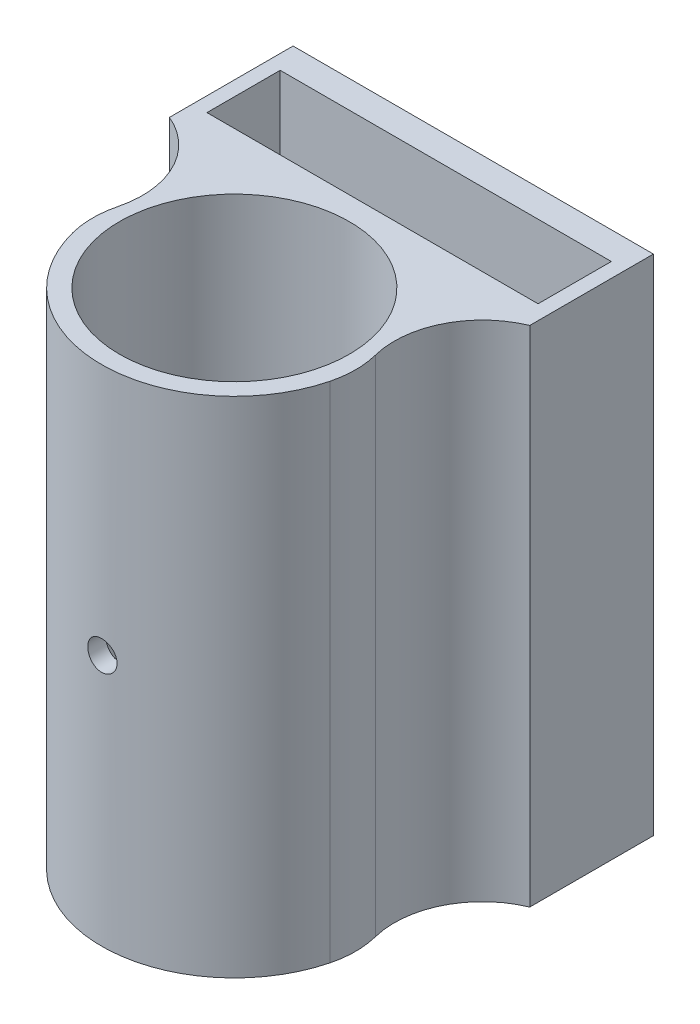
ISO-10303-21;
HEADER;
FILE_DESCRIPTION(('STEP AP214'),'2;1');
FILE_NAME('part.step','',(''),(''),'','','');
FILE_SCHEMA(('AUTOMOTIVE_DESIGN { 1 0 10303 214 1 1 1 1 }'));
ENDSEC;
DATA;
#1=APPLICATION_CONTEXT('core data for automotive mechanical design processes');
#2=APPLICATION_PROTOCOL_DEFINITION('international standard','automotive_design',2000,#1);
#3=PRODUCT_CONTEXT('',#1,'mechanical');
#4=PRODUCT('Part','Part','',(#3));
#5=PRODUCT_RELATED_PRODUCT_CATEGORY('part','',(#4));
#6=PRODUCT_DEFINITION_FORMATION('','',#4);
#7=PRODUCT_DEFINITION_CONTEXT('part definition',#1,'design');
#8=PRODUCT_DEFINITION('design','',#6,#7);
#9=PRODUCT_DEFINITION_SHAPE('','',#8);
#10=(LENGTH_UNIT() NAMED_UNIT(*) SI_UNIT(.MILLI.,.METRE.));
#11=(NAMED_UNIT(*) PLANE_ANGLE_UNIT() SI_UNIT($,.RADIAN.));
#12=(NAMED_UNIT(*) SI_UNIT($,.STERADIAN.) SOLID_ANGLE_UNIT());
#13=UNCERTAINTY_MEASURE_WITH_UNIT(LENGTH_MEASURE(1.E-05),#10,'distance_accuracy_value','');
#14=(GEOMETRIC_REPRESENTATION_CONTEXT(3) GLOBAL_UNCERTAINTY_ASSIGNED_CONTEXT((#13)) GLOBAL_UNIT_ASSIGNED_CONTEXT((#10,
#11,#12)) REPRESENTATION_CONTEXT('',''));
#15=CARTESIAN_POINT('',(0.,0.,0.));
#16=DIRECTION('',(0.,0.,1.));
#17=DIRECTION('',(1.,0.,0.));
#18=AXIS2_PLACEMENT_3D('',#15,#16,#17);
#19=CARTESIAN_POINT('',(0.,27.5,14.5));
#20=DIRECTION('',(0.,0.,-1.));
#21=DIRECTION('',(-1.,0.,0.));
#22=AXIS2_PLACEMENT_3D('',#19,#20,#21);
#23=CYLINDRICAL_SURFACE('',#22,1.6);
#24=CARTESIAN_POINT('',(0.,27.5,-15.0785283584372));
#25=DIRECTION('',(0.,0.,1.));
#26=DIRECTION('',(1.,0.,0.));
#27=AXIS2_PLACEMENT_3D('',#24,#25,#26);
#28=CIRCLE('',#27,1.6);
#29=CARTESIAN_POINT('',(1.6,27.5,-15.0785283584372));
#30=VERTEX_POINT('',#29);
#31=EDGE_CURVE('E183',#30,#30,#28,.F.);
#32=ORIENTED_EDGE('',*,*,#31,.T.);
#33=EDGE_LOOP('',(#32));
#34=FACE_BOUND('',#33,.T.);
#35=CARTESIAN_POINT('',(0.,29.1,-12.55));
#36=CARTESIAN_POINT('',(-0.0894833301704228,29.0999962076193,-12.5499987313846));
#37=CARTESIAN_POINT('',(-0.179022212237955,29.0924678743596,-12.5490328558177));
#38=CARTESIAN_POINT('',(-0.355607391045178,29.0625552971382,-12.5452726980721));
#39=CARTESIAN_POINT('',(-0.442651003326156,29.0401556370739,-12.542476518583));
#40=CARTESIAN_POINT('',(-0.611663727364265,28.9811719612015,-12.5353706866631));
#41=CARTESIAN_POINT('',(-0.69363624958007,28.9445976012485,-12.5310620647014));
#42=CARTESIAN_POINT('',(-0.850264649000386,28.858324091378,-12.5214102686347));
#43=CARTESIAN_POINT('',(-0.924921756327719,28.8086271532968,-12.5160672689167));
#44=CARTESIAN_POINT('',(-1.06524221125941,28.6972155363169,-12.5049088830017));
#45=CARTESIAN_POINT('',(-1.13085770265307,28.6354408050405,-12.499091224626));
#46=CARTESIAN_POINT('',(-1.25082012174993,28.5017561303857,-12.4876574784216));
#47=CARTESIAN_POINT('',(-1.30516646871056,28.4298456649943,-12.4820414009934));
#48=CARTESIAN_POINT('',(-1.40122693178799,28.2776187874859,-12.4716243588148));
#49=CARTESIAN_POINT('',(-1.4428960712504,28.1972737758863,-12.4668263221974));
#50=CARTESIAN_POINT('',(-1.51213203527364,28.0306549230687,-12.4586186868634));
#51=CARTESIAN_POINT('',(-1.53969941571866,27.9443813157051,-12.4552090334185));
#52=CARTESIAN_POINT('',(-1.579803594351,27.7688516136589,-12.4501859832421));
#53=CARTESIAN_POINT('',(-1.59242131099883,27.6796142883128,-12.4485629196102));
#54=CARTESIAN_POINT('',(-1.60251840715629,27.5002751149548,-12.4472672576538));
#55=CARTESIAN_POINT('',(-1.59999841912628,27.4101733032186,-12.4475945778413));
#56=CARTESIAN_POINT('',(-1.5799580361395,27.232227452455,-12.4501538541487));
#57=CARTESIAN_POINT('',(-1.56252686628452,27.1443731787067,-12.4523744808941));
#58=CARTESIAN_POINT('',(-1.51329818151392,26.9728469646147,-12.4584524882709));
#59=CARTESIAN_POINT('',(-1.48150036483147,26.8891751121625,-12.4623099032824));
#60=CARTESIAN_POINT('',(-1.40434539227785,26.7281122157532,-12.4712396682247));
#61=CARTESIAN_POINT('',(-1.35894955317275,26.6507399019988,-12.4763154759069));
#62=CARTESIAN_POINT('',(-1.2559148184711,26.5046776742575,-12.4871074529176));
#63=CARTESIAN_POINT('',(-1.19827534047084,26.4359881735416,-12.492823652702));
#64=CARTESIAN_POINT('',(-1.07189544472095,26.3087235937471,-12.5043026756613));
#65=CARTESIAN_POINT('',(-1.00307813715898,26.2502248464818,-12.5100655383666));
#66=CARTESIAN_POINT('',(-0.85656054767683,26.1455969795326,-12.5209501015383));
#67=CARTESIAN_POINT('',(-0.778860243844986,26.099467890362,-12.5260718004231));
#68=CARTESIAN_POINT('',(-0.616722753944609,26.0208883648442,-12.5351003208389));
#69=CARTESIAN_POINT('',(-0.532283176625783,25.9884428096234,-12.5390067087198));
#70=CARTESIAN_POINT('',(-0.359093469884159,25.9382124856379,-12.5451605622059));
#71=CARTESIAN_POINT('',(-0.270343550658581,25.9204270027219,-12.5474081086196));
#72=CARTESIAN_POINT('',(-0.0917123351499195,25.9001208551552,-12.5499805192907));
#73=CARTESIAN_POINT('',(-0.00184317304063769,25.8974950590728,-12.5503186250358));
#74=CARTESIAN_POINT('',(0.177053944125346,25.9073052310954,-12.5490698373495));
#75=CARTESIAN_POINT('',(0.266081917790112,25.9197408652343,-12.5474829866013));
#76=CARTESIAN_POINT('',(0.440458516079888,25.959233549322,-12.5425708329928));
#77=CARTESIAN_POINT('',(0.525818698965754,25.9862403709993,-12.5392515034267));
#78=CARTESIAN_POINT('',(0.690798531311235,26.0540565163483,-12.5312459490984));
#79=CARTESIAN_POINT('',(0.770417978620694,26.0948663257808,-12.5265596762309));
#80=CARTESIAN_POINT('',(0.922125097178057,26.1893836553831,-12.516309532134));
#81=CARTESIAN_POINT('',(0.994170160600689,26.2431590606342,-12.510741096539));
#82=CARTESIAN_POINT('',(1.12824967904296,26.3619851975019,-12.4993635419659));
#83=CARTESIAN_POINT('',(1.19028371988441,26.4270363953921,-12.4935544130424));
#84=CARTESIAN_POINT('',(1.30295415811664,26.5670311135367,-12.4823092377738));
#85=CARTESIAN_POINT('',(1.35352079241191,26.6420310029697,-12.4768756078544));
#86=CARTESIAN_POINT('',(1.44133879355319,26.7995210849199,-12.4670366735685));
#87=CARTESIAN_POINT('',(1.4785904363276,26.8820111221735,-12.4626313478929));
#88=CARTESIAN_POINT('',(1.53860851259869,27.051916382857,-12.4553643675405));
#89=CARTESIAN_POINT('',(1.56141403781726,27.1393176116935,-12.4524985501232));
#90=CARTESIAN_POINT('',(1.59201827737757,27.3167479864078,-12.4486232047332));
#91=CARTESIAN_POINT('',(1.59981772026141,27.4067770044917,-12.4476135866425));
#92=CARTESIAN_POINT('',(1.60017466687653,27.5862132057926,-12.4475676485379));
#93=CARTESIAN_POINT('',(1.59284177737647,27.6756201870882,-12.4485171382737));
#94=CARTESIAN_POINT('',(1.56337457173444,27.8519197238252,-12.4522518934506));
#95=CARTESIAN_POINT('',(1.54124025601322,27.9388122793382,-12.4550371588397));
#96=CARTESIAN_POINT('',(1.48283320344656,28.1076005037227,-12.4621251939827));
#97=CARTESIAN_POINT('',(1.44656596795327,28.1894981025926,-12.4664273732038));
#98=CARTESIAN_POINT('',(1.36093334824595,28.3460628989831,-12.4760654372791));
#99=CARTESIAN_POINT('',(1.31156777386014,28.4207299915041,-12.4814013371412));
#100=CARTESIAN_POINT('',(1.20073386741899,28.5612742589241,-12.4925519040131));
#101=CARTESIAN_POINT('',(1.13918388282476,28.6270868036932,-12.498369637983));
#102=CARTESIAN_POINT('',(1.00589901496968,28.7474909190979,-12.5098014138397));
#103=CARTESIAN_POINT('',(0.934161737398902,28.8020798444527,-12.5154154074509));
#104=CARTESIAN_POINT('',(0.782212446885113,28.8986718669238,-12.5258317602474));
#105=CARTESIAN_POINT('',(0.701968058634778,28.9406243663874,-12.5306308237861));
#106=CARTESIAN_POINT('',(0.535556047105882,29.0103981878923,-12.538843326089));
#107=CARTESIAN_POINT('',(0.44939494777081,29.0382347992469,-12.5422582632308));
#108=CARTESIAN_POINT('',(0.302327747537931,29.0723551505146,-12.5464985141084));
#109=CARTESIAN_POINT('',(0.242347391292654,29.0827069846661,-12.5478051428813));
#110=CARTESIAN_POINT('',(0.121586569637334,29.096530671138,-12.5495563134993));
#111=CARTESIAN_POINT('',(0.060806110459412,29.1000025770154,-12.5500008620552));
#112=CARTESIAN_POINT('',(0.,29.1,-12.55));
#113=B_SPLINE_CURVE_WITH_KNOTS('',3,(#35,#36,#37,#38,#39,#40,#41,#42,#43,#44,#45,#46,#47,#48,
#49,#50,#51,#52,#53,#54,#55,#56,#57,#58,#59,#60,#61,#62,#63,#64,#65,#66,#67,#68,#69,#70,#71,#72,
#73,#74,#75,#76,#77,#78,#79,#80,#81,#82,#83,#84,#85,#86,#87,#88,#89,#90,#91,#92,#93,#94,#95,#96,
#97,#98,#99,#100,#101,#102,#103,#104,#105,#106,#107,#108,#109,#110,#111,#112),.UNSPECIFIED.,.T.,
.F.,(4,2,2,2,2,2,2,2,2,2,2,2,2,2,2,2,2,2,2,2,2,2,2,2,2,2,2,2,2,2,2,2,2,2,2,2,2,2,4),(0.,
0.268227877230542,0.536734243295237,0.805058022469286,1.07333660397615,1.34298467687524,
1.61264664233013,1.88325445760796,2.15385160484095,2.42297729305399,2.69209173714863,
2.95960703679576,3.22712795577769,3.49541725668371,3.76371932239687,4.0339518850196,
4.3041851142384,4.57451465842362,4.84483103298632,5.11327050822394,5.38170403130067,
5.64921809573626,5.91674157562478,6.18569738833739,6.45466432549707,6.72522609580801,
6.99578225890502,7.26560312383989,7.53541088869875,7.80327123819353,8.07113158007406,
8.33888775915688,8.6066478259433,8.87626701588776,9.1459496793787,9.4166982504296,
9.68715293638044,9.86942175523435,10.0516891552083),.UNSPECIFIED.);
#114=CARTESIAN_POINT('',(0.,29.1,-12.55));
#115=VERTEX_POINT('',#114);
#116=EDGE_CURVE('E208',#115,#115,#113,.T.);
#117=ORIENTED_EDGE('',*,*,#116,.T.);
#118=EDGE_LOOP('',(#117));
#119=FACE_BOUND('',#118,.T.);
#120=ADVANCED_FACE('F37',(#34,#119),#23,.F.);
#121=CARTESIAN_POINT('',(-23.3751867394782,55.,-3.70334161895905));
#122=DIRECTION('',(0.,-1.,0.));
#123=DIRECTION('',(0.,0.,-1.));
#124=AXIS2_PLACEMENT_3D('',#121,#122,#123);
#125=CYLINDRICAL_SURFACE('',#124,9.616843495);
#126=CARTESIAN_POINT('',(-23.3751867394782,0.,-3.70334161895905));
#127=DIRECTION('',(0.,1.,0.));
#128=DIRECTION('',(0.,0.,1.));
#129=AXIS2_PLACEMENT_3D('',#126,#127,#128);
#130=CIRCLE('',#129,9.616843495);
#131=CARTESIAN_POINT('',(-14.0530432080162,0.,-1.34086012990048));
#132=VERTEX_POINT('',#131);
#133=CARTESIAN_POINT('',(-19.6718451205191,0.,-12.5785283584372));
#134=VERTEX_POINT('',#133);
#135=EDGE_CURVE('E281',#132,#134,#130,.T.);
#136=ORIENTED_EDGE('',*,*,#135,.F.);
#137=DIRECTION('',(0.,-1.,0.));
#138=VECTOR('',#137,1.);
#139=CARTESIAN_POINT('',(-14.0530432080162,55.,-1.34086012990048));
#140=LINE('',#139,#138);
#141=CARTESIAN_POINT('',(-14.0530432080162,55.,-1.34086012990048));
#142=VERTEX_POINT('',#141);
#143=EDGE_CURVE('E11',#132,#142,#140,.F.);
#144=ORIENTED_EDGE('',*,*,#143,.T.);
#145=CARTESIAN_POINT('',(-23.3751867394782,55.,-3.70334161895905));
#146=DIRECTION('',(0.,1.,0.));
#147=DIRECTION('',(0.,0.,1.));
#148=AXIS2_PLACEMENT_3D('',#145,#146,#147);
#149=CIRCLE('',#148,9.616843495);
#150=CARTESIAN_POINT('',(-19.6718451205191,55.,-12.5785283584372));
#151=VERTEX_POINT('',#150);
#152=EDGE_CURVE('E295',#142,#151,#149,.T.);
#153=ORIENTED_EDGE('',*,*,#152,.T.);
#154=DIRECTION('',(0.,-1.,0.));
#155=VECTOR('',#154,1.);
#156=CARTESIAN_POINT('',(-19.6718451205191,55.,-12.5785283584372));
#157=LINE('',#156,#155);
#158=EDGE_CURVE('E296',#151,#134,#157,.T.);
#159=ORIENTED_EDGE('',*,*,#158,.T.);
#160=EDGE_LOOP('',(#136,#144,#153,#159));
#161=FACE_BOUND('',#160,.T.);
#162=ADVANCED_FACE('F321',(#161),#125,.F.);
#163=CARTESIAN_POINT('',(0.,55.,0.));
#164=DIRECTION('',(0.,-1.,0.));
#165=DIRECTION('',(0.,0.,-1.));
#166=AXIS2_PLACEMENT_3D('',#163,#164,#165);
#167=CYLINDRICAL_SURFACE('',#166,14.5);
#168=CARTESIAN_POINT('',(0.,25.9,14.5));
#169=CARTESIAN_POINT('',(0.0895805581619937,25.9000038526064,14.4999988751595));
#170=CARTESIAN_POINT('',(0.179219087520294,25.9075484778788,14.4991610607946));
#171=CARTESIAN_POINT('',(0.356007452397157,25.9375295614161,14.4958994254079));
#172=CARTESIAN_POINT('',(0.443154495434816,25.9599820948211,14.4934738923952));
#173=CARTESIAN_POINT('',(0.612374486614682,26.0191143027765,14.4873104063263));
#174=CARTESIAN_POINT('',(0.694450597978411,26.0557850020704,14.4835732813569));
#175=CARTESIAN_POINT('',(0.851266164254818,26.142294283382,14.4752036211262));
#176=CARTESIAN_POINT('',(0.926006996500909,26.1921303868404,14.4705712544499));
#177=CARTESIAN_POINT('',(1.06637165382544,26.3037874600347,14.4609068870602));
#178=CARTESIAN_POINT('',(1.13195912738715,26.3656540041699,14.4558734110435));
#179=CARTESIAN_POINT('',(1.25184257275654,26.499518261695,14.4459862084253));
#180=CARTESIAN_POINT('',(1.30613800243063,26.5715164612299,14.4411324904633));
#181=CARTESIAN_POINT('',(1.40202770683504,26.723831508837,14.4321395539839));
#182=CARTESIAN_POINT('',(1.44358859504903,26.8041694965315,14.4280022257754));
#183=CARTESIAN_POINT('',(1.51261627195042,26.9707375337863,14.420929345328));
#184=CARTESIAN_POINT('',(1.5400834803728,27.0569674077889,14.4179937572995));
#185=CARTESIAN_POINT('',(1.58003517926628,27.2324978035706,14.4136704250157));
#186=CARTESIAN_POINT('',(1.59258044570808,27.3217843351626,14.412276403716));
#187=CARTESIAN_POINT('',(1.60252009213666,27.5012056281325,14.4111746833673));
#188=CARTESIAN_POINT('',(1.59991495177329,27.5913403625669,14.4114669309324));
#189=CARTESIAN_POINT('',(1.57967774633075,27.7694787445453,14.4136989888251));
#190=CARTESIAN_POINT('',(1.56211226600424,27.8574900607622,14.4156314986232));
#191=CARTESIAN_POINT('',(1.51255671481176,28.0293079198516,14.4209149428368));
#192=CARTESIAN_POINT('',(1.48056641111423,28.1131143948292,14.4242659001476));
#193=CARTESIAN_POINT('',(1.40299655261006,28.2743526039726,14.4320170310996));
#194=CARTESIAN_POINT('',(1.35738769181711,28.3517701263703,14.4364194632955));
#195=CARTESIAN_POINT('',(1.25389640729906,28.4978772329245,14.4457756638029));
#196=CARTESIAN_POINT('',(1.19601354589726,28.5665665057021,14.450729451772));
#197=CARTESIAN_POINT('',(1.06924656321819,28.6936540290379,14.460662708604));
#198=CARTESIAN_POINT('',(1.00030498044884,28.7519949787585,14.4656421723785));
#199=CARTESIAN_POINT('',(0.853576427702255,28.8562848613876,14.4750406759582));
#200=CARTESIAN_POINT('',(0.77578944423322,28.9022337753942,14.4794597149088));
#201=CARTESIAN_POINT('',(0.613536737921365,28.9804338710452,14.4872413875006));
#202=CARTESIAN_POINT('',(0.529069474527476,29.0126818821105,14.4906037765716));
#203=CARTESIAN_POINT('',(0.355873807848286,29.0625214261323,14.4958909302478));
#204=CARTESIAN_POINT('',(0.267145559948473,29.0801134931191,14.4978157472348));
#205=CARTESIAN_POINT('',(0.0884425167678776,29.1000684732124,14.5000041251901));
#206=CARTESIAN_POINT('',(-0.00152335370823746,29.1025104040089,14.5002763055608));
#207=CARTESIAN_POINT('',(-0.180583042306864,29.0923037158638,14.4991519174327));
#208=CARTESIAN_POINT('',(-0.269676874801433,29.0796553460491,14.497755376483));
#209=CARTESIAN_POINT('',(-0.444233402827322,29.0396926891508,14.4934559148678));
#210=CARTESIAN_POINT('',(-0.52970473114928,29.0124156632808,14.4905568220376));
#211=CARTESIAN_POINT('',(-0.694859044954825,28.9440084535001,14.4835772212825));
#212=CARTESIAN_POINT('',(-0.774541874204699,28.9028778958462,14.4794966814846));
#213=CARTESIAN_POINT('',(-0.926212868862904,28.807737059416,14.4705885250491));
#214=CARTESIAN_POINT('',(-0.998168485643841,28.7536751747238,14.4657579429838));
#215=CARTESIAN_POINT('',(-1.13201237598583,28.6342799121183,14.455900541647));
#216=CARTESIAN_POINT('',(-1.19390034046878,28.5689461882851,14.4508737163566));
#217=CARTESIAN_POINT('',(-1.30612884567153,28.4285157563987,14.4411641870401));
#218=CARTESIAN_POINT('',(-1.35641732249984,28.3533773127097,14.4364830963));
#219=CARTESIAN_POINT('',(-1.44366075668948,28.1956748976618,14.4280204116299));
#220=CARTESIAN_POINT('',(-1.48061593014139,28.1131110466724,14.4242388031225));
#221=CARTESIAN_POINT('',(-1.54005768031715,27.9430759520396,14.4180137253538));
#222=CARTESIAN_POINT('',(-1.56257460416374,27.8556154243023,14.4155674510334));
#223=CARTESIAN_POINT('',(-1.59259887795027,27.6781263651519,14.4122815896656));
#224=CARTESIAN_POINT('',(-1.60010676102554,27.5880979250687,14.4114419455492));
#225=CARTESIAN_POINT('',(-1.59989151540322,27.4085462530022,14.4114658022328));
#226=CARTESIAN_POINT('',(-1.59225017092316,27.3190229106152,14.412320157854));
#227=CARTESIAN_POINT('',(-1.56212552095625,27.1425404687122,14.4156161888096));
#228=CARTESIAN_POINT('',(-1.5396422039892,27.0555813711798,14.4180578653719));
#229=CARTESIAN_POINT('',(-1.48049559243863,26.8867004760195,14.4242507747722));
#230=CARTESIAN_POINT('',(-1.44383530730913,26.804777613586,14.4280017296633));
#231=CARTESIAN_POINT('',(-1.35738361948785,26.6482341756779,14.4363910846037));
#232=CARTESIAN_POINT('',(-1.30759219730362,26.5736136110434,14.4410294859704));
#233=CARTESIAN_POINT('',(-1.19598566853243,26.4333740742231,14.4507011278664));
#234=CARTESIAN_POINT('',(-1.1341095584088,26.3678037808468,14.455736290917));
#235=CARTESIAN_POINT('',(-1.0002142884991,26.2479433557878,14.4656167499085));
#236=CARTESIAN_POINT('',(-0.928192718448565,26.1936559121884,14.4704620003811));
#237=CARTESIAN_POINT('',(-0.775808833389732,26.0977690377806,14.4794322781402));
#238=CARTESIAN_POINT('',(-0.695422115921545,26.0562082063637,14.4835550984573));
#239=CARTESIAN_POINT('',(-0.528814070745927,25.9872320041905,14.4905927893544));
#240=CARTESIAN_POINT('',(-0.442599350936197,25.9598009073805,14.4935090021449));
#241=CARTESIAN_POINT('',(-0.29659353928702,25.9265974946495,14.4970835981556));
#242=CARTESIAN_POINT('',(-0.237731211818492,25.9166373322962,14.4981720614054));
#243=CARTESIAN_POINT('',(-0.119254485495047,25.9033373200196,14.4996306348689));
#244=CARTESIAN_POINT('',(-0.0596400906232779,25.8999974350484,14.5000007488856));
#245=CARTESIAN_POINT('',(0.,25.9,14.5));
#246=B_SPLINE_CURVE_WITH_KNOTS('',3,(#168,#169,#170,#171,#172,#173,#174,#175,#176,#177,#178,
#179,#180,#181,#182,#183,#184,#185,#186,#187,#188,#189,#190,#191,#192,#193,#194,#195,#196,#197,
#198,#199,#200,#201,#202,#203,#204,#205,#206,#207,#208,#209,#210,#211,#212,#213,#214,#215,#216,
#217,#218,#219,#220,#221,#222,#223,#224,#225,#226,#227,#228,#229,#230,#231,#232,#233,#234,#235,
#236,#237,#238,#239,#240,#241,#242,#243,#244,#245),.UNSPECIFIED.,.T.,.F.,(4,2,2,2,2,2,2,2,2,2,2,
2,2,2,2,2,2,2,2,2,2,2,2,2,2,2,2,2,2,2,2,2,2,2,2,2,2,2,4),(0.,0.268523867325561,
0.537337754160454,0.805982227035757,1.07457616007842,1.34420814740666,1.61385307684055,
1.88419900991095,2.15453689112899,2.42376989404743,2.69299437330934,2.9610268258497,
3.22906360486609,3.49768138502242,3.76630874539036,4.03638002938393,4.30645172531962,
4.57658588559547,4.84671020234784,5.11542445468339,5.38413427085689,5.65216287422476,
5.92019870909724,6.18932260340979,6.45845475829894,6.72877236497661,6.9990855904659,
7.26882877778208,7.53856238339458,7.80684377737667,8.07512537887342,8.34335006140626,
8.61157514210635,8.88119095439242,9.15087092787239,9.42136091038385,9.69154919003539,
9.87032539877783,10.0491006610713),.UNSPECIFIED.);
#247=CARTESIAN_POINT('',(0.,25.9,14.5));
#248=VERTEX_POINT('',#247);
#249=EDGE_CURVE('E200',#248,#248,#246,.T.);
#250=ORIENTED_EDGE('',*,*,#249,.F.);
#251=EDGE_LOOP('',(#250));
#252=FACE_BOUND('',#251,.T.);
#253=CARTESIAN_POINT('',(0.,0.,0.));
#254=DIRECTION('',(0.,1.,0.));
#255=DIRECTION('',(0.,0.,1.));
#256=AXIS2_PLACEMENT_3D('',#253,#254,#255);
#257=CIRCLE('',#256,14.5);
#258=CARTESIAN_POINT('',(14.0472283995736,0.,3.59518765716228));
#259=VERTEX_POINT('',#258);
#260=CARTESIAN_POINT('',(-14.0472283995736,0.,3.59518765716232));
#261=VERTEX_POINT('',#260);
#262=EDGE_CURVE('E276',#259,#261,#257,.F.);
#263=ORIENTED_EDGE('',*,*,#262,.F.);
#264=DIRECTION('',(0.,-1.,0.));
#265=VECTOR('',#264,1.);
#266=CARTESIAN_POINT('',(14.0472283995736,55.,3.59518765716228));
#267=LINE('',#266,#265);
#268=CARTESIAN_POINT('',(14.0472283995736,55.,3.59518765716228));
#269=VERTEX_POINT('',#268);
#270=EDGE_CURVE('E253',#259,#269,#267,.F.);
#271=ORIENTED_EDGE('',*,*,#270,.T.);
#272=CARTESIAN_POINT('',(0.,55.,0.));
#273=DIRECTION('',(0.,1.,0.));
#274=DIRECTION('',(0.,0.,1.));
#275=AXIS2_PLACEMENT_3D('',#272,#273,#274);
#276=CIRCLE('',#275,14.5);
#277=CARTESIAN_POINT('',(-14.0472283995736,55.,3.59518765716232));
#278=VERTEX_POINT('',#277);
#279=EDGE_CURVE('E261',#269,#278,#276,.F.);
#280=ORIENTED_EDGE('',*,*,#279,.T.);
#281=DIRECTION('',(0.,-1.,0.));
#282=VECTOR('',#281,1.);
#283=CARTESIAN_POINT('',(-14.0472283995736,55.,3.59518765716232));
#284=LINE('',#283,#282);
#285=EDGE_CURVE('E250',#278,#261,#284,.T.);
#286=ORIENTED_EDGE('',*,*,#285,.T.);
#287=EDGE_LOOP('',(#263,#271,#280,#286));
#288=FACE_BOUND('',#287,.T.);
#289=ADVANCED_FACE('F211',(#252,#288),#167,.T.);
#290=CARTESIAN_POINT('',(23.3751867394782,55.,-3.70334161895905));
#291=DIRECTION('',(0.,-1.,0.));
#292=DIRECTION('',(0.,0.,-1.));
#293=AXIS2_PLACEMENT_3D('',#290,#291,#292);
#294=CYLINDRICAL_SURFACE('',#293,9.616843495);
#295=CARTESIAN_POINT('',(23.3751867394782,55.,-3.70334161895905));
#296=DIRECTION('',(0.,1.,0.));
#297=DIRECTION('',(0.,0.,1.));
#298=AXIS2_PLACEMENT_3D('',#295,#296,#297);
#299=CIRCLE('',#298,9.616843495);
#300=CARTESIAN_POINT('',(14.0530432080162,55.,-1.34086012990049));
#301=VERTEX_POINT('',#300);
#302=CARTESIAN_POINT('',(19.6718451205191,55.,-12.5785283584372));
#303=VERTEX_POINT('',#302);
#304=EDGE_CURVE('E259',#301,#303,#299,.F.);
#305=ORIENTED_EDGE('',*,*,#304,.F.);
#306=DIRECTION('',(0.,-1.,0.));
#307=VECTOR('',#306,1.);
#308=CARTESIAN_POINT('',(14.0530432080162,55.,-1.34086012990049));
#309=LINE('',#308,#307);
#310=CARTESIAN_POINT('',(14.0530432080162,0.,-1.34086012990049));
#311=VERTEX_POINT('',#310);
#312=EDGE_CURVE('E242',#301,#311,#309,.T.);
#313=ORIENTED_EDGE('',*,*,#312,.T.);
#314=CARTESIAN_POINT('',(23.3751867394782,0.,-3.70334161895905));
#315=DIRECTION('',(0.,1.,0.));
#316=DIRECTION('',(0.,0.,1.));
#317=AXIS2_PLACEMENT_3D('',#314,#315,#316);
#318=CIRCLE('',#317,9.616843495);
#319=CARTESIAN_POINT('',(19.6718451205191,0.,-12.5785283584372));
#320=VERTEX_POINT('',#319);
#321=EDGE_CURVE('E278',#311,#320,#318,.F.);
#322=ORIENTED_EDGE('',*,*,#321,.T.);
#323=DIRECTION('',(0.,-1.,0.));
#324=VECTOR('',#323,1.);
#325=CARTESIAN_POINT('',(19.6718451205191,55.,-12.5785283584372));
#326=LINE('',#325,#324);
#327=EDGE_CURVE('E246',#303,#320,#326,.T.);
#328=ORIENTED_EDGE('',*,*,#327,.F.);
#329=EDGE_LOOP('',(#305,#313,#322,#328));
#330=FACE_BOUND('',#329,.T.);
#331=ADVANCED_FACE('F266',(#330),#294,.F.);
#332=CARTESIAN_POINT('',(19.6718451205191,55.,0.));
#333=DIRECTION('',(1.,0.,0.));
#334=DIRECTION('',(0.,0.,-1.));
#335=AXIS2_PLACEMENT_3D('',#332,#333,#334);
#336=PLANE('',#335);
#337=DIRECTION('',(0.,0.,1.));
#338=VECTOR('',#337,1.);
#339=CARTESIAN_POINT('',(19.6718451205191,0.,0.));
#340=LINE('',#339,#338);
#341=CARTESIAN_POINT('',(19.6718451205191,0.,-26.0785283584372));
#342=VERTEX_POINT('',#341);
#343=EDGE_CURVE('E283',#342,#320,#340,.T.);
#344=ORIENTED_EDGE('',*,*,#343,.F.);
#345=DIRECTION('',(0.,-1.,0.));
#346=VECTOR('',#345,1.);
#347=CARTESIAN_POINT('',(19.6718451205191,55.,-26.0785283584372));
#348=LINE('',#347,#346);
#349=CARTESIAN_POINT('',(19.6718451205191,55.,-26.0785283584372));
#350=VERTEX_POINT('',#349);
#351=EDGE_CURVE('E302',#350,#342,#348,.T.);
#352=ORIENTED_EDGE('',*,*,#351,.F.);
#353=DIRECTION('',(0.,0.,1.));
#354=VECTOR('',#353,1.);
#355=CARTESIAN_POINT('',(19.6718451205191,55.,0.));
#356=LINE('',#355,#354);
#357=EDGE_CURVE('E270',#350,#303,#356,.T.);
#358=ORIENTED_EDGE('',*,*,#357,.T.);
#359=ORIENTED_EDGE('',*,*,#327,.T.);
#360=EDGE_LOOP('',(#344,#352,#358,#359));
#361=FACE_BOUND('',#360,.T.);
#362=ADVANCED_FACE('F305',(#361),#336,.T.);
#363=CARTESIAN_POINT('',(0.,55.,-26.0785283584372));
#364=DIRECTION('',(0.,0.,-1.));
#365=DIRECTION('',(-1.,0.,0.));
#366=AXIS2_PLACEMENT_3D('',#363,#364,#365);
#367=PLANE('',#366);
#368=CARTESIAN_POINT('',(8.83883476483148,18.6611652351678,-26.0785283584372));
#369=DIRECTION('',(0.,0.,-1.));
#370=DIRECTION('',(-1.,0.,0.));
#371=AXIS2_PLACEMENT_3D('',#368,#369,#370);
#372=CIRCLE('',#371,1.6);
#373=CARTESIAN_POINT('',(7.23883476483148,18.6611652351678,-26.0785283584372));
#374=VERTEX_POINT('',#373);
#375=EDGE_CURVE('E191',#374,#374,#372,.T.);
#376=ORIENTED_EDGE('',*,*,#375,.F.);
#377=EDGE_LOOP('',(#376));
#378=FACE_BOUND('',#377,.T.);
#379=CARTESIAN_POINT('',(8.83883476483186,36.3388347648315,-26.0785283584372));
#380=DIRECTION('',(0.,0.,-1.));
#381=DIRECTION('',(-1.,0.,0.));
#382=AXIS2_PLACEMENT_3D('',#379,#380,#381);
#383=CIRCLE('',#382,1.59999999999999);
#384=CARTESIAN_POINT('',(7.23883476483187,36.3388347648315,-26.0785283584372));
#385=VERTEX_POINT('',#384);
#386=EDGE_CURVE('E188',#385,#385,#383,.T.);
#387=ORIENTED_EDGE('',*,*,#386,.F.);
#388=EDGE_LOOP('',(#387));
#389=FACE_BOUND('',#388,.T.);
#390=CARTESIAN_POINT('',(-8.83883476483183,36.3388347648319,-26.0785283584372));
#391=DIRECTION('',(0.,0.,-1.));
#392=DIRECTION('',(-1.,0.,0.));
#393=AXIS2_PLACEMENT_3D('',#390,#391,#392);
#394=CIRCLE('',#393,1.6);
#395=CARTESIAN_POINT('',(-10.4388347648318,36.3388347648319,-26.0785283584372));
#396=VERTEX_POINT('',#395);
#397=EDGE_CURVE('E184',#396,#396,#394,.T.);
#398=ORIENTED_EDGE('',*,*,#397,.F.);
#399=EDGE_LOOP('',(#398));
#400=FACE_BOUND('',#399,.T.);
#401=CARTESIAN_POINT('',(-8.83883476483221,18.6611652351682,-26.0785283584372));
#402=DIRECTION('',(0.,0.,-1.));
#403=DIRECTION('',(-1.,0.,0.));
#404=AXIS2_PLACEMENT_3D('',#401,#402,#403);
#405=CIRCLE('',#404,1.6);
#406=CARTESIAN_POINT('',(-10.4388347648322,18.6611652351682,-26.0785283584372));
#407=VERTEX_POINT('',#406);
#408=EDGE_CURVE('E187',#407,#407,#405,.T.);
#409=ORIENTED_EDGE('',*,*,#408,.F.);
#410=EDGE_LOOP('',(#409));
#411=FACE_BOUND('',#410,.T.);
#412=CARTESIAN_POINT('',(0.,27.5,-26.0785283584372));
#413=DIRECTION('',(0.,0.,-1.));
#414=DIRECTION('',(-1.,0.,0.));
#415=AXIS2_PLACEMENT_3D('',#412,#413,#414);
#416=CIRCLE('',#415,1.6);
#417=CARTESIAN_POINT('',(-1.6,27.5,-26.0785283584372));
#418=VERTEX_POINT('',#417);
#419=EDGE_CURVE('E196',#418,#418,#416,.T.);
#420=ORIENTED_EDGE('',*,*,#419,.F.);
#421=EDGE_LOOP('',(#420));
#422=FACE_BOUND('',#421,.T.);
#423=DIRECTION('',(1.,0.,0.));
#424=VECTOR('',#423,1.);
#425=CARTESIAN_POINT('',(0.,0.,-26.0785283584372));
#426=LINE('',#425,#424);
#427=CARTESIAN_POINT('',(-19.6718451205191,0.,-26.0785283584372));
#428=VERTEX_POINT('',#427);
#429=EDGE_CURVE('E289',#428,#342,#426,.T.);
#430=ORIENTED_EDGE('',*,*,#429,.F.);
#431=DIRECTION('',(0.,-1.,0.));
#432=VECTOR('',#431,1.);
#433=CARTESIAN_POINT('',(-19.6718451205191,55.,-26.0785283584372));
#434=LINE('',#433,#432);
#435=CARTESIAN_POINT('',(-19.6718451205191,55.,-26.0785283584372));
#436=VERTEX_POINT('',#435);
#437=EDGE_CURVE('E299',#436,#428,#434,.T.);
#438=ORIENTED_EDGE('',*,*,#437,.F.);
#439=DIRECTION('',(1.,0.,0.));
#440=VECTOR('',#439,1.);
#441=CARTESIAN_POINT('',(0.,55.,-26.0785283584372));
#442=LINE('',#441,#440);
#443=EDGE_CURVE('E313',#436,#350,#442,.T.);
#444=ORIENTED_EDGE('',*,*,#443,.T.);
#445=ORIENTED_EDGE('',*,*,#351,.T.);
#446=EDGE_LOOP('',(#430,#438,#444,#445));
#447=FACE_BOUND('',#446,.T.);
#448=ADVANCED_FACE('F309',(#378,#389,#400,#411,#422,#447),#367,.T.);
#449=CARTESIAN_POINT('',(-19.6718451205191,55.,0.));
#450=DIRECTION('',(1.,0.,0.));
#451=DIRECTION('',(0.,0.,-1.));
#452=AXIS2_PLACEMENT_3D('',#449,#450,#451);
#453=PLANE('',#452);
#454=DIRECTION('',(0.,0.,1.));
#455=VECTOR('',#454,1.);
#456=CARTESIAN_POINT('',(-19.6718451205191,0.,0.));
#457=LINE('',#456,#455);
#458=EDGE_CURVE('E292',#428,#134,#457,.T.);
#459=ORIENTED_EDGE('',*,*,#458,.T.);
#460=ORIENTED_EDGE('',*,*,#158,.F.);
#461=DIRECTION('',(0.,0.,1.));
#462=VECTOR('',#461,1.);
#463=CARTESIAN_POINT('',(-19.6718451205191,55.,0.));
#464=LINE('',#463,#462);
#465=EDGE_CURVE('E300',#436,#151,#464,.T.);
#466=ORIENTED_EDGE('',*,*,#465,.F.);
#467=ORIENTED_EDGE('',*,*,#437,.T.);
#468=EDGE_LOOP('',(#459,#460,#466,#467));
#469=FACE_BOUND('',#468,.T.);
#470=ADVANCED_FACE('F320',(#469),#453,.F.);
#471=CARTESIAN_POINT('',(0.,55.,0.));
#472=DIRECTION('',(0.,1.,0.));
#473=DIRECTION('',(0.,0.,1.));
#474=AXIS2_PLACEMENT_3D('',#471,#472,#473);
#475=PLANE('',#474);
#476=DIRECTION('',(0.,0.,-1.));
#477=VECTOR('',#476,1.);
#478=CARTESIAN_POINT('',(18.0777219336337,55.,-15.0785283584372));
#479=LINE('',#478,#477);
#480=CARTESIAN_POINT('',(18.0777219336337,55.,-15.0785283584372));
#481=VERTEX_POINT('',#480);
#482=CARTESIAN_POINT('',(18.0777219336337,55.,-23.0785283584372));
#483=VERTEX_POINT('',#482);
#484=EDGE_CURVE('E133',#481,#483,#479,.T.);
#485=ORIENTED_EDGE('',*,*,#484,.F.);
#486=DIRECTION('',(1.,0.,0.));
#487=VECTOR('',#486,1.);
#488=CARTESIAN_POINT('',(-18.0777219336337,55.,-15.0785283584372));
#489=LINE('',#488,#487);
#490=CARTESIAN_POINT('',(-18.0777219336337,55.,-15.0785283584372));
#491=VERTEX_POINT('',#490);
#492=EDGE_CURVE('E152',#491,#481,#489,.T.);
#493=ORIENTED_EDGE('',*,*,#492,.F.);
#494=DIRECTION('',(0.,0.,1.));
#495=VECTOR('',#494,1.);
#496=CARTESIAN_POINT('',(-18.0777219336337,55.,-15.0785283584372));
#497=LINE('',#496,#495);
#498=CARTESIAN_POINT('',(-18.0777219336337,55.,-23.0785283584372));
#499=VERTEX_POINT('',#498);
#500=EDGE_CURVE('E155',#499,#491,#497,.T.);
#501=ORIENTED_EDGE('',*,*,#500,.F.);
#502=DIRECTION('',(-1.,0.,0.));
#503=VECTOR('',#502,1.);
#504=CARTESIAN_POINT('',(-18.0777219336337,55.,-23.0785283584372));
#505=LINE('',#504,#503);
#506=EDGE_CURVE('E161',#483,#499,#505,.T.);
#507=ORIENTED_EDGE('',*,*,#506,.F.);
#508=EDGE_LOOP('',(#485,#493,#501,#507));
#509=FACE_BOUND('',#508,.T.);
#510=CARTESIAN_POINT('',(0.,55.,0.));
#511=DIRECTION('',(0.,1.,0.));
#512=DIRECTION('',(0.,0.,1.));
#513=AXIS2_PLACEMENT_3D('',#510,#511,#512);
#514=CIRCLE('',#513,12.55);
#515=CARTESIAN_POINT('',(0.,55.,12.55));
#516=VERTEX_POINT('',#515);
#517=EDGE_CURVE('E209',#516,#516,#514,.T.);
#518=ORIENTED_EDGE('',*,*,#517,.F.);
#519=EDGE_LOOP('',(#518));
#520=FACE_BOUND('',#519,.T.);
#521=ORIENTED_EDGE('',*,*,#279,.F.);
#522=CARTESIAN_POINT('',(4.35948467572974,55.,1.11574789360208));
#523=DIRECTION('',(0.,1.,0.));
#524=DIRECTION('',(0.,0.,1.));
#525=AXIS2_PLACEMENT_3D('',#522,#523,#524);
#526=CIRCLE('',#525,10.);
#527=EDGE_CURVE('E45',#269,#301,#526,.T.);
#528=ORIENTED_EDGE('',*,*,#527,.T.);
#529=ORIENTED_EDGE('',*,*,#304,.T.);
#530=ORIENTED_EDGE('',*,*,#357,.F.);
#531=ORIENTED_EDGE('',*,*,#443,.F.);
#532=ORIENTED_EDGE('',*,*,#465,.T.);
#533=ORIENTED_EDGE('',*,*,#152,.F.);
#534=CARTESIAN_POINT('',(-4.35948467572975,55.,1.1157478936021));
#535=DIRECTION('',(0.,1.,0.));
#536=DIRECTION('',(0.,0.,1.));
#537=AXIS2_PLACEMENT_3D('',#534,#535,#536);
#538=CIRCLE('',#537,10.);
#539=EDGE_CURVE('E57',#142,#278,#538,.T.);
#540=ORIENTED_EDGE('',*,*,#539,.T.);
#541=EDGE_LOOP('',(#521,#528,#529,#530,#531,#532,#533,#540));
#542=FACE_BOUND('',#541,.T.);
#543=ADVANCED_FACE('F257',(#509,#520,#542),#475,.T.);
#544=CARTESIAN_POINT('',(0.,0.,0.));
#545=DIRECTION('',(0.,1.,0.));
#546=DIRECTION('',(0.,0.,1.));
#547=AXIS2_PLACEMENT_3D('',#544,#545,#546);
#548=PLANE('',#547);
#549=DIRECTION('',(1.,0.,0.));
#550=VECTOR('',#549,1.);
#551=CARTESIAN_POINT('',(-18.0777219336337,0.,-15.0785283584372));
#552=LINE('',#551,#550);
#553=CARTESIAN_POINT('',(-18.0777219336337,0.,-15.0785283584372));
#554=VERTEX_POINT('',#553);
#555=CARTESIAN_POINT('',(18.0777219336337,0.,-15.0785283584372));
#556=VERTEX_POINT('',#555);
#557=EDGE_CURVE('E138',#554,#556,#552,.T.);
#558=ORIENTED_EDGE('',*,*,#557,.T.);
#559=DIRECTION('',(0.,0.,-1.));
#560=VECTOR('',#559,1.);
#561=CARTESIAN_POINT('',(18.0777219336337,0.,-15.0785283584372));
#562=LINE('',#561,#560);
#563=CARTESIAN_POINT('',(18.0777219336337,0.,-23.0785283584372));
#564=VERTEX_POINT('',#563);
#565=EDGE_CURVE('E130',#556,#564,#562,.T.);
#566=ORIENTED_EDGE('',*,*,#565,.T.);
#567=DIRECTION('',(-1.,0.,0.));
#568=VECTOR('',#567,1.);
#569=CARTESIAN_POINT('',(-18.0777219336337,0.,-23.0785283584372));
#570=LINE('',#569,#568);
#571=CARTESIAN_POINT('',(-18.0777219336337,0.,-23.0785283584372));
#572=VERTEX_POINT('',#571);
#573=EDGE_CURVE('E142',#564,#572,#570,.T.);
#574=ORIENTED_EDGE('',*,*,#573,.T.);
#575=DIRECTION('',(0.,0.,1.));
#576=VECTOR('',#575,1.);
#577=CARTESIAN_POINT('',(-18.0777219336337,0.,-15.0785283584372));
#578=LINE('',#577,#576);
#579=EDGE_CURVE('E147',#572,#554,#578,.T.);
#580=ORIENTED_EDGE('',*,*,#579,.T.);
#581=EDGE_LOOP('',(#558,#566,#574,#580));
#582=FACE_BOUND('',#581,.T.);
#583=CARTESIAN_POINT('',(0.,0.,0.));
#584=DIRECTION('',(0.,1.,0.));
#585=DIRECTION('',(0.,0.,1.));
#586=AXIS2_PLACEMENT_3D('',#583,#584,#585);
#587=CIRCLE('',#586,12.55);
#588=CARTESIAN_POINT('',(0.,0.,12.55));
#589=VERTEX_POINT('',#588);
#590=EDGE_CURVE('E207',#589,#589,#587,.T.);
#591=ORIENTED_EDGE('',*,*,#590,.T.);
#592=EDGE_LOOP('',(#591));
#593=FACE_BOUND('',#592,.T.);
#594=ORIENTED_EDGE('',*,*,#321,.F.);
#595=CARTESIAN_POINT('',(4.35948467572974,0.,1.11574789360208));
#596=DIRECTION('',(0.,1.,0.));
#597=DIRECTION('',(0.,0.,1.));
#598=AXIS2_PLACEMENT_3D('',#595,#596,#597);
#599=CIRCLE('',#598,10.);
#600=EDGE_CURVE('E248',#311,#259,#599,.F.);
#601=ORIENTED_EDGE('',*,*,#600,.T.);
#602=ORIENTED_EDGE('',*,*,#262,.T.);
#603=CARTESIAN_POINT('',(-4.35948467572975,0.,1.1157478936021));
#604=DIRECTION('',(0.,1.,0.));
#605=DIRECTION('',(0.,0.,1.));
#606=AXIS2_PLACEMENT_3D('',#603,#604,#605);
#607=CIRCLE('',#606,10.);
#608=EDGE_CURVE('E245',#261,#132,#607,.F.);
#609=ORIENTED_EDGE('',*,*,#608,.T.);
#610=ORIENTED_EDGE('',*,*,#135,.T.);
#611=ORIENTED_EDGE('',*,*,#458,.F.);
#612=ORIENTED_EDGE('',*,*,#429,.T.);
#613=ORIENTED_EDGE('',*,*,#343,.T.);
#614=EDGE_LOOP('',(#594,#601,#602,#609,#610,#611,#612,#613));
#615=FACE_BOUND('',#614,.T.);
#616=ADVANCED_FACE('F149',(#582,#593,#615),#548,.F.);
#617=CARTESIAN_POINT('',(0.,55.,0.));
#618=DIRECTION('',(0.,-1.,0.));
#619=DIRECTION('',(0.,0.,-1.));
#620=AXIS2_PLACEMENT_3D('',#617,#618,#619);
#621=CYLINDRICAL_SURFACE('',#620,12.55);
#622=ORIENTED_EDGE('',*,*,#116,.F.);
#623=EDGE_LOOP('',(#622));
#624=FACE_BOUND('',#623,.T.);
#625=CARTESIAN_POINT('',(-1.6,27.5,12.4475901282136));
#626=CARTESIAN_POINT('',(-1.59999620469654,27.5894799984185,12.4475914358878));
#627=CARTESIAN_POINT('',(-1.59246841310975,27.6790155584418,12.4485653942581));
#628=CARTESIAN_POINT('',(-1.5625581828513,27.8555938356341,12.4523544128491));
#629=CARTESIAN_POINT('',(-1.54016031631005,27.9426338657197,12.4551713851733));
#630=CARTESIAN_POINT('',(-1.48118188632877,28.1116390126609,12.4623222950079));
#631=CARTESIAN_POINT('',(-1.44461106377866,28.1936075703017,12.4666551904455));
#632=CARTESIAN_POINT('',(-1.3583458860863,28.3502293177265,12.4763484847584));
#633=CARTESIAN_POINT('',(-1.30865373419451,28.4248837327721,12.4817087110895));
#634=CARTESIAN_POINT('',(-1.19724696769282,28.5652071903882,12.4928876152246));
#635=CARTESIAN_POINT('',(-1.13547122999117,28.6308275328185,12.4987085302844));
#636=CARTESIAN_POINT('',(-1.00178250064552,28.7507993252188,12.5101328362404));
#637=CARTESIAN_POINT('',(-0.929869000280413,28.8051502093399,12.5157362162026));
#638=CARTESIAN_POINT('',(-0.777639426479479,28.9012154466186,12.5261170494701));
#639=CARTESIAN_POINT('',(-0.697295275673342,28.9428856482538,12.5308915927089));
#640=CARTESIAN_POINT('',(-0.530678292568627,29.0121238129427,12.5390521830155));
#641=CARTESIAN_POINT('',(-0.444405688939375,29.0396923195739,12.5424382836025));
#642=CARTESIAN_POINT('',(-0.268879211254954,29.0797988076841,12.5474247076928));
#643=CARTESIAN_POINT('',(-0.179644130139089,29.0924178209462,12.5490346553021));
#644=CARTESIAN_POINT('',(-0.00030936214039295,29.1025182880656,12.5503202515641));
#645=CARTESIAN_POINT('',(0.0897902892890806,29.1000003600161,12.5499959791976));
#646=CARTESIAN_POINT('',(0.26774514447209,29.0799632683616,12.5474574502377));
#647=CARTESIAN_POINT('',(0.35561033973491,29.0625312551088,12.5452541738298));
#648=CARTESIAN_POINT('',(0.527157960253065,29.0132971095039,12.5392175194246));
#649=CARTESIAN_POINT('',(0.610840303263283,28.9814946947179,12.5353841093889));
#650=CARTESIAN_POINT('',(0.771916032315077,28.9043301406045,12.5264990003822));
#651=CARTESIAN_POINT('',(0.849291202371126,28.8589303807456,12.5214439289644));
#652=CARTESIAN_POINT('',(0.995357485935263,28.7558872451716,12.5106808554124));
#653=CARTESIAN_POINT('',(1.0640481849655,28.6982432854375,12.5049728221395));
#654=CARTESIAN_POINT('',(1.19130781451711,28.5718601731574,12.4934945238494));
#655=CARTESIAN_POINT('',(1.2498013147458,28.5030450551653,12.4877241049039));
#656=CARTESIAN_POINT('',(1.35441963294338,28.3565337292957,12.4768114057448));
#657=CARTESIAN_POINT('',(1.40054440927436,28.278837491522,12.4716691276457));
#658=CARTESIAN_POINT('',(1.47912081693256,28.1167011808709,12.4625950121382));
#659=CARTESIAN_POINT('',(1.51156624916394,28.0322580710743,12.4586637237333));
#660=CARTESIAN_POINT('',(1.56179524825052,27.8590606745518,12.452467304788));
#661=CARTESIAN_POINT('',(1.57957955116765,27.7703066044944,12.4502020906028));
#662=CARTESIAN_POINT('',(1.59988123952493,27.591673335779,12.4476096417632));
#663=CARTESIAN_POINT('',(1.60250484948517,27.5018063978632,12.4472689233666));
#664=CARTESIAN_POINT('',(1.59269109899725,27.3229142513433,12.448528369907));
#665=CARTESIAN_POINT('',(1.58025407282172,27.2338890241016,12.4501284917668));
#666=CARTESIAN_POINT('',(1.54076159102892,27.0595267130172,12.4550770136257));
#667=CARTESIAN_POINT('',(1.51375770734357,26.9741777580956,12.4584192445306));
#668=CARTESIAN_POINT('',(1.44595119024475,26.8092190849173,12.4664703891509));
#669=CARTESIAN_POINT('',(1.40514805360555,26.729609576093,12.4711793527069));
#670=CARTESIAN_POINT('',(1.31064065647712,26.5779094279023,12.4814656304754));
#671=CARTESIAN_POINT('',(1.25686681858843,26.5058624531158,12.4870475686955));
#672=CARTESIAN_POINT('',(1.13804266613153,26.3717783501298,12.4984363882803));
#673=CARTESIAN_POINT('',(1.072991894923,26.309741627475,12.5042432787467));
#674=CARTESIAN_POINT('',(0.932996048694568,26.1970651097213,12.515469198216));
#675=CARTESIAN_POINT('',(0.85799452015797,26.1464951700938,12.5208857196069));
#676=CARTESIAN_POINT('',(0.700500251415902,26.0586713738663,12.5306829747877));
#677=CARTESIAN_POINT('',(0.618007667423529,26.021417239668,12.53506373017));
#678=CARTESIAN_POINT('',(0.448103784441363,25.9613975758501,12.5422847433587));
#679=CARTESIAN_POINT('',(0.360706865019628,25.9385918752558,12.5451292690615));
#680=CARTESIAN_POINT('',(0.183285601985016,25.9079858257298,12.5489750623688));
#681=CARTESIAN_POINT('',(0.0932613820659842,25.9001847715296,12.5499764166085));
#682=CARTESIAN_POINT('',(-0.0861773641081343,25.8998230071087,12.550022591503));
#683=CARTESIAN_POINT('',(-0.175591688864322,25.9071546603992,12.5490812303832));
#684=CARTESIAN_POINT('',(-0.351906227770501,25.9366219717215,12.545375248056));
#685=CARTESIAN_POINT('',(-0.438806444167244,25.9587576165234,12.542610628478));
#686=CARTESIAN_POINT('',(-0.607610447938513,26.0171703458688,12.5355673692183));
#687=CARTESIAN_POINT('',(-0.689516119101977,26.05344206009,12.5312893045544));
#688=CARTESIAN_POINT('',(-0.846095199540328,26.1390861452029,12.5216925116215));
#689=CARTESIAN_POINT('',(-0.920768508835952,26.1884586971636,12.5163737689693));
#690=CARTESIAN_POINT('',(-1.06131274704197,26.2993004175075,12.5052439692923));
#691=CARTESIAN_POINT('',(-1.12712030351641,26.360849633617,12.4994298077586));
#692=CARTESIAN_POINT('',(-1.24751471251214,26.4941308931275,12.487989197533));
#693=CARTESIAN_POINT('',(-1.30209890649971,26.5658653423683,12.48236279358));
#694=CARTESIAN_POINT('',(-1.39868567283757,26.7178121915955,12.4719106431542));
#695=CARTESIAN_POINT('',(-1.44063683967363,26.7980574804868,12.4670882026952));
#696=CARTESIAN_POINT('',(-1.51040792241628,26.9644713722258,12.4588287283558));
#697=CARTESIAN_POINT('',(-1.53824314360359,27.0506334441439,12.4553901948064));
#698=CARTESIAN_POINT('',(-1.57235969342617,27.1976969493398,12.4511190871892));
#699=CARTESIAN_POINT('',(-1.58270981714141,27.2576723711304,12.4498023566711));
#700=CARTESIAN_POINT('',(-1.59653123229029,27.3784233150593,12.4480374363871));
#701=CARTESIAN_POINT('',(-1.60000257888793,27.4391988307772,12.4475892396561));
#702=CARTESIAN_POINT('',(-1.6,27.5,12.4475901282136));
#703=B_SPLINE_CURVE_WITH_KNOTS('',3,(#625,#626,#627,#628,#629,#630,#631,#632,#633,#634,#635,
#636,#637,#638,#639,#640,#641,#642,#643,#644,#645,#646,#647,#648,#649,#650,#651,#652,#653,#654,
#655,#656,#657,#658,#659,#660,#661,#662,#663,#664,#665,#666,#667,#668,#669,#670,#671,#672,#673,
#674,#675,#676,#677,#678,#679,#680,#681,#682,#683,#684,#685,#686,#687,#688,#689,#690,#691,#692,
#693,#694,#695,#696,#697,#698,#699,#700,#701,#702),.UNSPECIFIED.,.T.,.F.,(4,2,2,2,2,2,2,2,2,2,2,
2,2,2,2,2,2,2,2,2,2,2,2,2,2,2,2,2,2,2,2,2,2,2,2,2,2,2,4),(0.,0.268217867979375,
0.536714450793567,0.805026825693406,1.07329417589817,1.34295534964019,1.61263006001706,
1.88323325332017,2.1538260149042,2.42294525331423,2.69205350274002,2.95959987722867,
3.22715151026648,3.49545034117723,3.76376197217425,4.03398110690228,4.30420115128116,
4.57454352053874,4.84487231643204,5.113304715076,5.38173115593971,5.64921344831483,
5.91670549618101,6.18566564665561,6.45463669076126,6.72520473220692,6.99576713271586,
7.26557394876154,7.53536808267397,7.80324982921234,8.07113133634874,8.33891117378647,
8.60669471245092,8.8763009071107,9.14597089134571,9.41672381584559,9.68718254416757,
9.86943657915034,10.0516891525501),.UNSPECIFIED.);
#704=CARTESIAN_POINT('',(-1.6,27.5,12.4475901282136));
#705=VERTEX_POINT('',#704);
#706=EDGE_CURVE('E199',#705,#705,#703,.T.);
#707=ORIENTED_EDGE('',*,*,#706,.F.);
#708=EDGE_LOOP('',(#707));
#709=FACE_BOUND('',#708,.T.);
#710=ORIENTED_EDGE('',*,*,#517,.T.);
#711=EDGE_LOOP('',(#710));
#712=FACE_BOUND('',#711,.T.);
#713=ORIENTED_EDGE('',*,*,#590,.F.);
#714=EDGE_LOOP('',(#713));
#715=FACE_BOUND('',#714,.T.);
#716=ADVANCED_FACE('F221',(#624,#709,#712,#715),#621,.F.);
#717=ORIENTED_EDGE('',*,*,#249,.T.);
#718=EDGE_LOOP('',(#717));
#719=FACE_BOUND('',#718,.T.);
#720=ORIENTED_EDGE('',*,*,#706,.T.);
#721=EDGE_LOOP('',(#720));
#722=FACE_BOUND('',#721,.T.);
#723=ADVANCED_FACE('F215',(#719,#722),#23,.F.);
#724=CARTESIAN_POINT('',(0.,27.5,-23.0785283584372));
#725=DIRECTION('',(0.,0.,-1.));
#726=DIRECTION('',(-1.,0.,0.));
#727=AXIS2_PLACEMENT_3D('',#724,#725,#726);
#728=CIRCLE('',#727,1.6);
#729=CARTESIAN_POINT('',(-1.6,27.5,-23.0785283584372));
#730=VERTEX_POINT('',#729);
#731=EDGE_CURVE('E180',#730,#730,#728,.F.);
#732=ORIENTED_EDGE('',*,*,#731,.T.);
#733=EDGE_LOOP('',(#732));
#734=FACE_BOUND('',#733,.T.);
#735=ORIENTED_EDGE('',*,*,#419,.T.);
#736=EDGE_LOOP('',(#735));
#737=FACE_BOUND('',#736,.T.);
#738=ADVANCED_FACE('F220',(#734,#737),#23,.F.);
#739=CARTESIAN_POINT('',(-8.83883476483221,18.6611652351682,-18.0785283584372));
#740=DIRECTION('',(0.,0.,-1.));
#741=DIRECTION('',(-1.,0.,0.));
#742=AXIS2_PLACEMENT_3D('',#739,#740,#741);
#743=CYLINDRICAL_SURFACE('',#742,1.6);
#744=CARTESIAN_POINT('',(-8.83883476483221,18.6611652351682,-23.0785283584372));
#745=DIRECTION('',(0.,0.,-1.));
#746=DIRECTION('',(-1.,0.,0.));
#747=AXIS2_PLACEMENT_3D('',#744,#745,#746);
#748=CIRCLE('',#747,1.6);
#749=CARTESIAN_POINT('',(-10.4388347648322,18.6611652351682,-23.0785283584372));
#750=VERTEX_POINT('',#749);
#751=EDGE_CURVE('E177',#750,#750,#748,.F.);
#752=ORIENTED_EDGE('',*,*,#751,.T.);
#753=EDGE_LOOP('',(#752));
#754=FACE_BOUND('',#753,.T.);
#755=ORIENTED_EDGE('',*,*,#408,.T.);
#756=EDGE_LOOP('',(#755));
#757=FACE_BOUND('',#756,.T.);
#758=ADVANCED_FACE('F223',(#754,#757),#743,.F.);
#759=CARTESIAN_POINT('',(-8.83883476483183,36.3388347648319,-18.0785283584372));
#760=DIRECTION('',(0.,0.,-1.));
#761=DIRECTION('',(-1.,0.,0.));
#762=AXIS2_PLACEMENT_3D('',#759,#760,#761);
#763=CYLINDRICAL_SURFACE('',#762,1.6);
#764=CARTESIAN_POINT('',(-8.83883476483183,36.3388347648319,-23.0785283584372));
#765=DIRECTION('',(0.,0.,-1.));
#766=DIRECTION('',(-1.,0.,0.));
#767=AXIS2_PLACEMENT_3D('',#764,#765,#766);
#768=CIRCLE('',#767,1.6);
#769=CARTESIAN_POINT('',(-10.4388347648318,36.3388347648319,-23.0785283584372));
#770=VERTEX_POINT('',#769);
#771=EDGE_CURVE('E174',#770,#770,#768,.F.);
#772=ORIENTED_EDGE('',*,*,#771,.T.);
#773=EDGE_LOOP('',(#772));
#774=FACE_BOUND('',#773,.T.);
#775=ORIENTED_EDGE('',*,*,#397,.T.);
#776=EDGE_LOOP('',(#775));
#777=FACE_BOUND('',#776,.T.);
#778=ADVANCED_FACE('F349',(#774,#777),#763,.F.);
#779=CARTESIAN_POINT('',(8.83883476483186,36.3388347648315,-18.0785283584372));
#780=DIRECTION('',(0.,0.,-1.));
#781=DIRECTION('',(-1.,0.,0.));
#782=AXIS2_PLACEMENT_3D('',#779,#780,#781);
#783=CYLINDRICAL_SURFACE('',#782,1.59999999999999);
#784=CARTESIAN_POINT('',(8.83883476483186,36.3388347648315,-23.0785283584372));
#785=DIRECTION('',(0.,0.,-1.));
#786=DIRECTION('',(-1.,0.,0.));
#787=AXIS2_PLACEMENT_3D('',#784,#785,#786);
#788=CIRCLE('',#787,1.59999999999999);
#789=CARTESIAN_POINT('',(7.23883476483187,36.3388347648315,-23.0785283584372));
#790=VERTEX_POINT('',#789);
#791=EDGE_CURVE('E171',#790,#790,#788,.F.);
#792=ORIENTED_EDGE('',*,*,#791,.T.);
#793=EDGE_LOOP('',(#792));
#794=FACE_BOUND('',#793,.T.);
#795=ORIENTED_EDGE('',*,*,#386,.T.);
#796=EDGE_LOOP('',(#795));
#797=FACE_BOUND('',#796,.T.);
#798=ADVANCED_FACE('F419',(#794,#797),#783,.F.);
#799=CARTESIAN_POINT('',(8.83883476483148,18.6611652351678,-18.0785283584372));
#800=DIRECTION('',(0.,0.,-1.));
#801=DIRECTION('',(-1.,0.,0.));
#802=AXIS2_PLACEMENT_3D('',#799,#800,#801);
#803=CYLINDRICAL_SURFACE('',#802,1.6);
#804=CARTESIAN_POINT('',(8.83883476483148,18.6611652351678,-23.0785283584372));
#805=DIRECTION('',(0.,0.,-1.));
#806=DIRECTION('',(-1.,0.,0.));
#807=AXIS2_PLACEMENT_3D('',#804,#805,#806);
#808=CIRCLE('',#807,1.6);
#809=CARTESIAN_POINT('',(7.23883476483148,18.6611652351678,-23.0785283584372));
#810=VERTEX_POINT('',#809);
#811=EDGE_CURVE('E167',#810,#810,#808,.F.);
#812=ORIENTED_EDGE('',*,*,#811,.T.);
#813=EDGE_LOOP('',(#812));
#814=FACE_BOUND('',#813,.T.);
#815=ORIENTED_EDGE('',*,*,#375,.T.);
#816=EDGE_LOOP('',(#815));
#817=FACE_BOUND('',#816,.T.);
#818=ADVANCED_FACE('F429',(#814,#817),#803,.F.);
#819=CARTESIAN_POINT('',(-18.0777219336337,0.,-15.0785283584372));
#820=DIRECTION('',(0.,0.,1.));
#821=DIRECTION('',(1.,0.,0.));
#822=AXIS2_PLACEMENT_3D('',#819,#820,#821);
#823=PLANE('',#822);
#824=ORIENTED_EDGE('',*,*,#492,.T.);
#825=DIRECTION('',(0.,1.,0.));
#826=VECTOR('',#825,1.);
#827=CARTESIAN_POINT('',(18.0777219336337,0.,-15.0785283584372));
#828=LINE('',#827,#826);
#829=EDGE_CURVE('E165',#556,#481,#828,.T.);
#830=ORIENTED_EDGE('',*,*,#829,.F.);
#831=ORIENTED_EDGE('',*,*,#557,.F.);
#832=DIRECTION('',(0.,1.,0.));
#833=VECTOR('',#832,1.);
#834=CARTESIAN_POINT('',(-18.0777219336337,0.,-15.0785283584372));
#835=LINE('',#834,#833);
#836=EDGE_CURVE('E168',#554,#491,#835,.T.);
#837=ORIENTED_EDGE('',*,*,#836,.T.);
#838=EDGE_LOOP('',(#824,#830,#831,#837));
#839=FACE_BOUND('',#838,.T.);
#840=ORIENTED_EDGE('',*,*,#31,.F.);
#841=EDGE_LOOP('',(#840));
#842=FACE_BOUND('',#841,.T.);
#843=ADVANCED_FACE('F438',(#839,#842),#823,.F.);
#844=CARTESIAN_POINT('',(-18.0777219336337,0.,-23.0785283584372));
#845=DIRECTION('',(0.,0.,-1.));
#846=DIRECTION('',(-1.,0.,0.));
#847=AXIS2_PLACEMENT_3D('',#844,#845,#846);
#848=PLANE('',#847);
#849=ORIENTED_EDGE('',*,*,#751,.F.);
#850=EDGE_LOOP('',(#849));
#851=FACE_BOUND('',#850,.T.);
#852=ORIENTED_EDGE('',*,*,#791,.F.);
#853=EDGE_LOOP('',(#852));
#854=FACE_BOUND('',#853,.T.);
#855=ORIENTED_EDGE('',*,*,#506,.T.);
#856=DIRECTION('',(0.,1.,0.));
#857=VECTOR('',#856,1.);
#858=CARTESIAN_POINT('',(-18.0777219336337,0.,-23.0785283584372));
#859=LINE('',#858,#857);
#860=EDGE_CURVE('E137',#572,#499,#859,.T.);
#861=ORIENTED_EDGE('',*,*,#860,.F.);
#862=ORIENTED_EDGE('',*,*,#573,.F.);
#863=DIRECTION('',(0.,1.,0.));
#864=VECTOR('',#863,1.);
#865=CARTESIAN_POINT('',(18.0777219336337,0.,-23.0785283584372));
#866=LINE('',#865,#864);
#867=EDGE_CURVE('E126',#564,#483,#866,.T.);
#868=ORIENTED_EDGE('',*,*,#867,.T.);
#869=EDGE_LOOP('',(#855,#861,#862,#868));
#870=FACE_BOUND('',#869,.T.);
#871=ORIENTED_EDGE('',*,*,#811,.F.);
#872=EDGE_LOOP('',(#871));
#873=FACE_BOUND('',#872,.T.);
#874=ORIENTED_EDGE('',*,*,#771,.F.);
#875=EDGE_LOOP('',(#874));
#876=FACE_BOUND('',#875,.T.);
#877=ORIENTED_EDGE('',*,*,#731,.F.);
#878=EDGE_LOOP('',(#877));
#879=FACE_BOUND('',#878,.T.);
#880=ADVANCED_FACE('F143',(#851,#854,#870,#873,#876,#879),#848,.F.);
#881=CARTESIAN_POINT('',(18.0777219336337,0.,-15.0785283584372));
#882=DIRECTION('',(1.,0.,0.));
#883=DIRECTION('',(0.,0.,-1.));
#884=AXIS2_PLACEMENT_3D('',#881,#882,#883);
#885=PLANE('',#884);
#886=ORIENTED_EDGE('',*,*,#484,.T.);
#887=ORIENTED_EDGE('',*,*,#867,.F.);
#888=ORIENTED_EDGE('',*,*,#565,.F.);
#889=ORIENTED_EDGE('',*,*,#829,.T.);
#890=EDGE_LOOP('',(#886,#887,#888,#889));
#891=FACE_BOUND('',#890,.T.);
#892=ADVANCED_FACE('F128',(#891),#885,.F.);
#893=CARTESIAN_POINT('',(-18.0777219336337,0.,-15.0785283584372));
#894=DIRECTION('',(-1.,0.,0.));
#895=DIRECTION('',(0.,0.,1.));
#896=AXIS2_PLACEMENT_3D('',#893,#894,#895);
#897=PLANE('',#896);
#898=ORIENTED_EDGE('',*,*,#500,.T.);
#899=ORIENTED_EDGE('',*,*,#836,.F.);
#900=ORIENTED_EDGE('',*,*,#579,.F.);
#901=ORIENTED_EDGE('',*,*,#860,.T.);
#902=EDGE_LOOP('',(#898,#899,#900,#901));
#903=FACE_BOUND('',#902,.T.);
#904=ADVANCED_FACE('F464',(#903),#897,.F.);
#905=CARTESIAN_POINT('',(4.35948467572974,55.,1.11574789360208));
#906=DIRECTION('',(0.,1.,0.));
#907=DIRECTION('',(0.,0.,1.));
#908=AXIS2_PLACEMENT_3D('',#905,#906,#907);
#909=CYLINDRICAL_SURFACE('',#908,10.);
#910=ORIENTED_EDGE('',*,*,#527,.F.);
#911=ORIENTED_EDGE('',*,*,#270,.F.);
#912=ORIENTED_EDGE('',*,*,#600,.F.);
#913=ORIENTED_EDGE('',*,*,#312,.F.);
#914=EDGE_LOOP('',(#910,#911,#912,#913));
#915=FACE_BOUND('',#914,.T.);
#916=ADVANCED_FACE('F272',(#915),#909,.T.);
#917=CARTESIAN_POINT('',(-4.35948467572975,55.,1.1157478936021));
#918=DIRECTION('',(0.,1.,0.));
#919=DIRECTION('',(0.,0.,1.));
#920=AXIS2_PLACEMENT_3D('',#917,#918,#919);
#921=CYLINDRICAL_SURFACE('',#920,10.);
#922=ORIENTED_EDGE('',*,*,#539,.F.);
#923=ORIENTED_EDGE('',*,*,#143,.F.);
#924=ORIENTED_EDGE('',*,*,#608,.F.);
#925=ORIENTED_EDGE('',*,*,#285,.F.);
#926=EDGE_LOOP('',(#922,#923,#924,#925));
#927=FACE_BOUND('',#926,.T.);
#928=ADVANCED_FACE('F39',(#927),#921,.T.);
#929=CLOSED_SHELL('',(#120,#162,#289,#331,#362,#448,#470,#543,#616,#716,#723,#738,#758,#778,
#798,#818,#843,#880,#892,#904,#916,#928));
#930=MANIFOLD_SOLID_BREP('B2',#929);
#931=ADVANCED_BREP_SHAPE_REPRESENTATION('',(#18,#930),#14);
#932=SHAPE_DEFINITION_REPRESENTATION(#9,#931);
ENDSEC;
END-ISO-10303-21;
